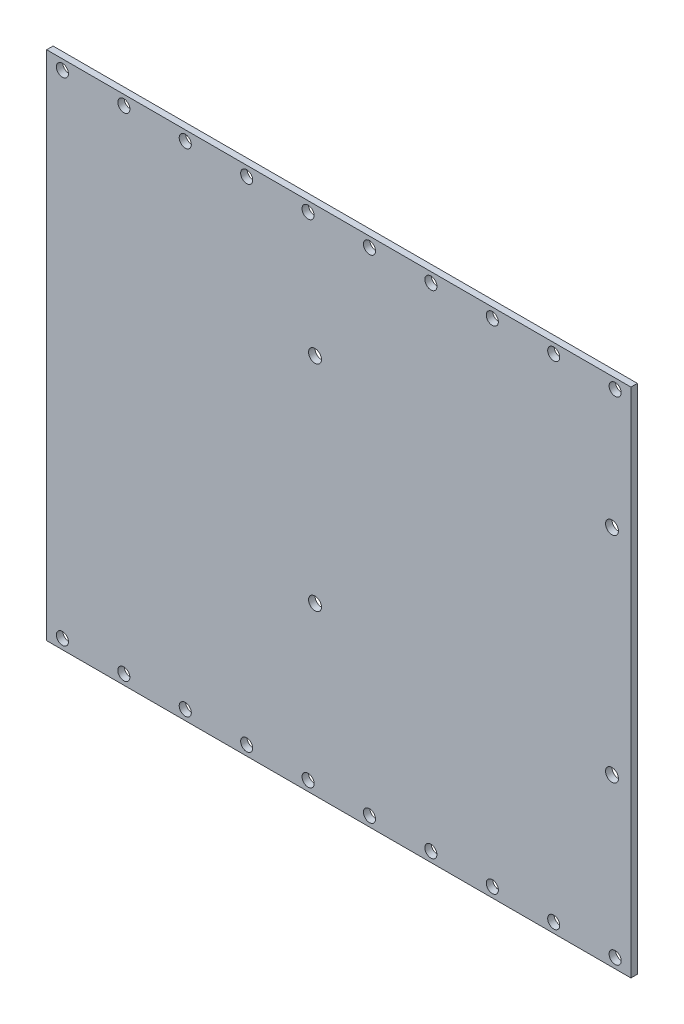
ISO-10303-21;
HEADER;
FILE_DESCRIPTION(('STEP AP214'),'2;1');
FILE_NAME('part.step','',(''),(''),'','','');
FILE_SCHEMA(('AUTOMOTIVE_DESIGN { 1 0 10303 214 1 1 1 1 }'));
ENDSEC;
DATA;
#1=APPLICATION_CONTEXT('core data for automotive mechanical design processes');
#2=APPLICATION_PROTOCOL_DEFINITION('international standard','automotive_design',2000,#1);
#3=PRODUCT_CONTEXT('',#1,'mechanical');
#4=PRODUCT('Part','Part','',(#3));
#5=PRODUCT_RELATED_PRODUCT_CATEGORY('part','',(#4));
#6=PRODUCT_DEFINITION_FORMATION('','',#4);
#7=PRODUCT_DEFINITION_CONTEXT('part definition',#1,'design');
#8=PRODUCT_DEFINITION('design','',#6,#7);
#9=PRODUCT_DEFINITION_SHAPE('','',#8);
#10=(LENGTH_UNIT() NAMED_UNIT(*) SI_UNIT(.MILLI.,.METRE.));
#11=(NAMED_UNIT(*) PLANE_ANGLE_UNIT() SI_UNIT($,.RADIAN.));
#12=(NAMED_UNIT(*) SI_UNIT($,.STERADIAN.) SOLID_ANGLE_UNIT());
#13=UNCERTAINTY_MEASURE_WITH_UNIT(LENGTH_MEASURE(1.E-05),#10,'distance_accuracy_value','');
#14=(GEOMETRIC_REPRESENTATION_CONTEXT(3) GLOBAL_UNCERTAINTY_ASSIGNED_CONTEXT((#13)) GLOBAL_UNIT_ASSIGNED_CONTEXT((#10,
#11,#12)) REPRESENTATION_CONTEXT('',''));
#15=CARTESIAN_POINT('',(0.,0.,0.));
#16=DIRECTION('',(0.,0.,1.));
#17=DIRECTION('',(1.,0.,0.));
#18=AXIS2_PLACEMENT_3D('',#15,#16,#17);
#19=CARTESIAN_POINT('',(72.5,63.5,1.6));
#20=DIRECTION('',(-1.,0.,0.));
#21=DIRECTION('',(0.,-1.,0.));
#22=AXIS2_PLACEMENT_3D('',#19,#20,#21);
#23=PLANE('',#22);
#24=DIRECTION('',(0.,1.,0.));
#25=VECTOR('',#24,1.);
#26=CARTESIAN_POINT('',(72.5,63.5,0.));
#27=LINE('',#26,#25);
#28=CARTESIAN_POINT('',(72.5,-63.5,0.));
#29=VERTEX_POINT('',#28);
#30=CARTESIAN_POINT('',(72.5,63.5,0.));
#31=VERTEX_POINT('',#30);
#32=EDGE_CURVE('E101',#29,#31,#27,.T.);
#33=ORIENTED_EDGE('',*,*,#32,.T.);
#34=DIRECTION('',(0.,0.,-1.));
#35=VECTOR('',#34,1.);
#36=CARTESIAN_POINT('',(72.5,63.5,1.6));
#37=LINE('',#36,#35);
#38=CARTESIAN_POINT('',(72.5,63.5,1.6));
#39=VERTEX_POINT('',#38);
#40=EDGE_CURVE('E11',#39,#31,#37,.T.);
#41=ORIENTED_EDGE('',*,*,#40,.F.);
#42=DIRECTION('',(0.,1.,0.));
#43=VECTOR('',#42,1.);
#44=CARTESIAN_POINT('',(72.5,63.5,1.6));
#45=LINE('',#44,#43);
#46=CARTESIAN_POINT('',(72.5,-63.5,1.6));
#47=VERTEX_POINT('',#46);
#48=EDGE_CURVE('E89',#47,#39,#45,.T.);
#49=ORIENTED_EDGE('',*,*,#48,.F.);
#50=DIRECTION('',(0.,0.,-1.));
#51=VECTOR('',#50,1.);
#52=CARTESIAN_POINT('',(72.5,-63.5,1.6));
#53=LINE('',#52,#51);
#54=EDGE_CURVE('E97',#47,#29,#53,.T.);
#55=ORIENTED_EDGE('',*,*,#54,.T.);
#56=EDGE_LOOP('',(#33,#41,#49,#55));
#57=FACE_BOUND('',#56,.T.);
#58=ADVANCED_FACE('F38',(#57),#23,.F.);
#59=CARTESIAN_POINT('',(-72.5,63.5,1.6));
#60=DIRECTION('',(0.,-1.,0.));
#61=DIRECTION('',(1.,0.,0.));
#62=AXIS2_PLACEMENT_3D('',#59,#60,#61);
#63=PLANE('',#62);
#64=DIRECTION('',(-1.,0.,0.));
#65=VECTOR('',#64,1.);
#66=CARTESIAN_POINT('',(-72.5,63.5,0.));
#67=LINE('',#66,#65);
#68=CARTESIAN_POINT('',(-72.5,63.5,0.));
#69=VERTEX_POINT('',#68);
#70=EDGE_CURVE('E93',#31,#69,#67,.T.);
#71=ORIENTED_EDGE('',*,*,#70,.T.);
#72=DIRECTION('',(0.,0.,-1.));
#73=VECTOR('',#72,1.);
#74=CARTESIAN_POINT('',(-72.5,63.5,1.6));
#75=LINE('',#74,#73);
#76=CARTESIAN_POINT('',(-72.5,63.5,1.6));
#77=VERTEX_POINT('',#76);
#78=EDGE_CURVE('E46',#77,#69,#75,.T.);
#79=ORIENTED_EDGE('',*,*,#78,.F.);
#80=DIRECTION('',(-1.,0.,0.));
#81=VECTOR('',#80,1.);
#82=CARTESIAN_POINT('',(-72.5,63.5,1.6));
#83=LINE('',#82,#81);
#84=EDGE_CURVE('E84',#39,#77,#83,.T.);
#85=ORIENTED_EDGE('',*,*,#84,.F.);
#86=ORIENTED_EDGE('',*,*,#40,.T.);
#87=EDGE_LOOP('',(#71,#79,#85,#86));
#88=FACE_BOUND('',#87,.T.);
#89=ADVANCED_FACE('F92',(#88),#63,.F.);
#90=CARTESIAN_POINT('',(-72.5,63.5,1.6));
#91=DIRECTION('',(1.,0.,0.));
#92=DIRECTION('',(0.,1.,0.));
#93=AXIS2_PLACEMENT_3D('',#90,#91,#92);
#94=PLANE('',#93);
#95=DIRECTION('',(0.,-1.,0.));
#96=VECTOR('',#95,1.);
#97=CARTESIAN_POINT('',(-72.5,63.5,0.));
#98=LINE('',#97,#96);
#99=CARTESIAN_POINT('',(-72.5,-63.5,0.));
#100=VERTEX_POINT('',#99);
#101=EDGE_CURVE('E71',#69,#100,#98,.T.);
#102=ORIENTED_EDGE('',*,*,#101,.T.);
#103=DIRECTION('',(0.,0.,-1.));
#104=VECTOR('',#103,1.);
#105=CARTESIAN_POINT('',(-72.5,-63.5,1.6));
#106=LINE('',#105,#104);
#107=CARTESIAN_POINT('',(-72.5,-63.5,1.6));
#108=VERTEX_POINT('',#107);
#109=EDGE_CURVE('E94',#108,#100,#106,.T.);
#110=ORIENTED_EDGE('',*,*,#109,.F.);
#111=DIRECTION('',(0.,-1.,0.));
#112=VECTOR('',#111,1.);
#113=CARTESIAN_POINT('',(-72.5,63.5,1.6));
#114=LINE('',#113,#112);
#115=EDGE_CURVE('E87',#77,#108,#114,.T.);
#116=ORIENTED_EDGE('',*,*,#115,.F.);
#117=ORIENTED_EDGE('',*,*,#78,.T.);
#118=EDGE_LOOP('',(#102,#110,#116,#117));
#119=FACE_BOUND('',#118,.T.);
#120=ADVANCED_FACE('F95',(#119),#94,.F.);
#121=CARTESIAN_POINT('',(-72.5,-63.5,1.6));
#122=DIRECTION('',(0.,1.,0.));
#123=DIRECTION('',(0.,0.,1.));
#124=AXIS2_PLACEMENT_3D('',#121,#122,#123);
#125=PLANE('',#124);
#126=DIRECTION('',(1.,0.,0.));
#127=VECTOR('',#126,1.);
#128=CARTESIAN_POINT('',(-72.5,-63.5,0.));
#129=LINE('',#128,#127);
#130=EDGE_CURVE('E77',#100,#29,#129,.T.);
#131=ORIENTED_EDGE('',*,*,#130,.T.);
#132=ORIENTED_EDGE('',*,*,#54,.F.);
#133=DIRECTION('',(1.,0.,0.));
#134=VECTOR('',#133,1.);
#135=CARTESIAN_POINT('',(-72.5,-63.5,1.6));
#136=LINE('',#135,#134);
#137=EDGE_CURVE('E54',#108,#47,#136,.T.);
#138=ORIENTED_EDGE('',*,*,#137,.F.);
#139=ORIENTED_EDGE('',*,*,#109,.T.);
#140=EDGE_LOOP('',(#131,#132,#138,#139));
#141=FACE_BOUND('',#140,.T.);
#142=ADVANCED_FACE('F109',(#141),#125,.F.);
#143=CARTESIAN_POINT('',(0.,0.,1.6));
#144=DIRECTION('',(0.,0.,1.));
#145=DIRECTION('',(1.,0.,0.));
#146=AXIS2_PLACEMENT_3D('',#143,#144,#145);
#147=PLANE('',#146);
#148=CARTESIAN_POINT('',(67.8,31.,1.6));
#149=DIRECTION('',(0.,0.,1.));
#150=DIRECTION('',(1.,0.,0.));
#151=AXIS2_PLACEMENT_3D('',#148,#149,#150);
#152=CIRCLE('',#151,1.60000000000001);
#153=CARTESIAN_POINT('',(69.4,31.,1.6));
#154=VERTEX_POINT('',#153);
#155=EDGE_CURVE('E255',#154,#154,#152,.T.);
#156=ORIENTED_EDGE('',*,*,#155,.F.);
#157=EDGE_LOOP('',(#156));
#158=FACE_BOUND('',#157,.T.);
#159=CARTESIAN_POINT('',(-5.90000000000002,31.,1.6));
#160=DIRECTION('',(0.,0.,1.));
#161=DIRECTION('',(1.,0.,0.));
#162=AXIS2_PLACEMENT_3D('',#159,#160,#161);
#163=CIRCLE('',#162,1.59999999999999);
#164=CARTESIAN_POINT('',(-4.30000000000003,31.,1.6));
#165=VERTEX_POINT('',#164);
#166=EDGE_CURVE('E249',#165,#165,#163,.T.);
#167=ORIENTED_EDGE('',*,*,#166,.F.);
#168=EDGE_LOOP('',(#167));
#169=FACE_BOUND('',#168,.T.);
#170=CARTESIAN_POINT('',(-5.90000000000002,-22.2,1.6));
#171=DIRECTION('',(0.,0.,1.));
#172=DIRECTION('',(1.,0.,0.));
#173=AXIS2_PLACEMENT_3D('',#170,#171,#172);
#174=CIRCLE('',#173,1.60000000000002);
#175=CARTESIAN_POINT('',(-4.3,-22.2,1.6));
#176=VERTEX_POINT('',#175);
#177=EDGE_CURVE('E243',#176,#176,#174,.T.);
#178=ORIENTED_EDGE('',*,*,#177,.F.);
#179=EDGE_LOOP('',(#178));
#180=FACE_BOUND('',#179,.T.);
#181=CARTESIAN_POINT('',(67.8,-22.2,1.6));
#182=DIRECTION('',(0.,0.,1.));
#183=DIRECTION('',(1.,0.,0.));
#184=AXIS2_PLACEMENT_3D('',#181,#182,#183);
#185=CIRCLE('',#184,1.6);
#186=CARTESIAN_POINT('',(69.4,-22.2,1.6));
#187=VERTEX_POINT('',#186);
#188=EDGE_CURVE('E237',#187,#187,#185,.T.);
#189=ORIENTED_EDGE('',*,*,#188,.F.);
#190=EDGE_LOOP('',(#189));
#191=FACE_BOUND('',#190,.T.);
#192=CARTESIAN_POINT('',(68.5799999999953,61.0499964397141,1.6));
#193=DIRECTION('',(0.,0.,-1.));
#194=DIRECTION('',(-1.,0.,0.));
#195=AXIS2_PLACEMENT_3D('',#192,#193,#194);
#196=CIRCLE('',#195,1.49999999999999);
#197=CARTESIAN_POINT('',(67.0799999999953,61.0499964397141,1.6));
#198=VERTEX_POINT('',#197);
#199=EDGE_CURVE('E228',#198,#198,#196,.T.);
#200=ORIENTED_EDGE('',*,*,#199,.T.);
#201=EDGE_LOOP('',(#200));
#202=FACE_BOUND('',#201,.T.);
#203=CARTESIAN_POINT('',(38.0999999999953,61.0499964397141,1.6));
#204=DIRECTION('',(0.,0.,-1.));
#205=DIRECTION('',(-1.,0.,0.));
#206=AXIS2_PLACEMENT_3D('',#203,#204,#205);
#207=CIRCLE('',#206,1.49999999999999);
#208=CARTESIAN_POINT('',(36.5999999999953,61.0499964397141,1.6));
#209=VERTEX_POINT('',#208);
#210=EDGE_CURVE('E222',#209,#209,#207,.T.);
#211=ORIENTED_EDGE('',*,*,#210,.T.);
#212=EDGE_LOOP('',(#211));
#213=FACE_BOUND('',#212,.T.);
#214=CARTESIAN_POINT('',(7.61999999999532,61.0499964397141,1.6));
#215=DIRECTION('',(0.,0.,-1.));
#216=DIRECTION('',(-1.,0.,0.));
#217=AXIS2_PLACEMENT_3D('',#214,#215,#216);
#218=CIRCLE('',#217,1.49999999999999);
#219=CARTESIAN_POINT('',(6.11999999999534,61.0499964397141,1.6));
#220=VERTEX_POINT('',#219);
#221=EDGE_CURVE('E216',#220,#220,#218,.T.);
#222=ORIENTED_EDGE('',*,*,#221,.T.);
#223=EDGE_LOOP('',(#222));
#224=FACE_BOUND('',#223,.T.);
#225=CARTESIAN_POINT('',(-22.8600000000047,61.0499964397141,1.6));
#226=DIRECTION('',(0.,0.,-1.));
#227=DIRECTION('',(-1.,0.,0.));
#228=AXIS2_PLACEMENT_3D('',#225,#226,#227);
#229=CIRCLE('',#228,1.49999999999999);
#230=CARTESIAN_POINT('',(-24.3600000000047,61.0499964397141,1.6));
#231=VERTEX_POINT('',#230);
#232=EDGE_CURVE('E210',#231,#231,#229,.T.);
#233=ORIENTED_EDGE('',*,*,#232,.T.);
#234=EDGE_LOOP('',(#233));
#235=FACE_BOUND('',#234,.T.);
#236=CARTESIAN_POINT('',(-53.3400000000047,61.0499964397141,1.6));
#237=DIRECTION('',(0.,0.,-1.));
#238=DIRECTION('',(-1.,0.,0.));
#239=AXIS2_PLACEMENT_3D('',#236,#237,#238);
#240=CIRCLE('',#239,1.49999999999999);
#241=CARTESIAN_POINT('',(-54.8400000000047,61.0499964397141,1.6));
#242=VERTEX_POINT('',#241);
#243=EDGE_CURVE('E204',#242,#242,#240,.T.);
#244=ORIENTED_EDGE('',*,*,#243,.T.);
#245=EDGE_LOOP('',(#244));
#246=FACE_BOUND('',#245,.T.);
#247=CARTESIAN_POINT('',(-68.5800000000047,61.0499964397141,1.6));
#248=DIRECTION('',(0.,0.,-1.));
#249=DIRECTION('',(-1.,0.,0.));
#250=AXIS2_PLACEMENT_3D('',#247,#248,#249);
#251=CIRCLE('',#250,1.49999999999999);
#252=CARTESIAN_POINT('',(-70.0800000000047,61.0499964397141,1.6));
#253=VERTEX_POINT('',#252);
#254=EDGE_CURVE('E198',#253,#253,#251,.T.);
#255=ORIENTED_EDGE('',*,*,#254,.T.);
#256=EDGE_LOOP('',(#255));
#257=FACE_BOUND('',#256,.T.);
#258=CARTESIAN_POINT('',(68.5799999999953,-61.0500035602859,1.6));
#259=DIRECTION('',(0.,0.,-1.));
#260=DIRECTION('',(-1.,0.,0.));
#261=AXIS2_PLACEMENT_3D('',#258,#259,#260);
#262=CIRCLE('',#261,1.49999999999999);
#263=CARTESIAN_POINT('',(67.0799999999953,-61.0500035602859,1.6));
#264=VERTEX_POINT('',#263);
#265=EDGE_CURVE('E192',#264,#264,#262,.T.);
#266=ORIENTED_EDGE('',*,*,#265,.T.);
#267=EDGE_LOOP('',(#266));
#268=FACE_BOUND('',#267,.T.);
#269=CARTESIAN_POINT('',(53.3399999999953,-61.0500035602859,1.6));
#270=DIRECTION('',(0.,0.,-1.));
#271=DIRECTION('',(-1.,0.,0.));
#272=AXIS2_PLACEMENT_3D('',#269,#270,#271);
#273=CIRCLE('',#272,1.49999999999999);
#274=CARTESIAN_POINT('',(51.8399999999953,-61.0500035602859,1.6));
#275=VERTEX_POINT('',#274);
#276=EDGE_CURVE('E186',#275,#275,#273,.T.);
#277=ORIENTED_EDGE('',*,*,#276,.T.);
#278=EDGE_LOOP('',(#277));
#279=FACE_BOUND('',#278,.T.);
#280=CARTESIAN_POINT('',(38.0999999999953,-61.0500035602859,1.6));
#281=DIRECTION('',(0.,0.,-1.));
#282=DIRECTION('',(-1.,0.,0.));
#283=AXIS2_PLACEMENT_3D('',#280,#281,#282);
#284=CIRCLE('',#283,1.49999999999999);
#285=CARTESIAN_POINT('',(36.5999999999953,-61.0500035602859,1.6));
#286=VERTEX_POINT('',#285);
#287=EDGE_CURVE('E180',#286,#286,#284,.T.);
#288=ORIENTED_EDGE('',*,*,#287,.T.);
#289=EDGE_LOOP('',(#288));
#290=FACE_BOUND('',#289,.T.);
#291=CARTESIAN_POINT('',(22.8599999999953,-61.0500035602859,1.6));
#292=DIRECTION('',(0.,0.,-1.));
#293=DIRECTION('',(-1.,0.,0.));
#294=AXIS2_PLACEMENT_3D('',#291,#292,#293);
#295=CIRCLE('',#294,1.49999999999999);
#296=CARTESIAN_POINT('',(21.3599999999953,-61.0500035602859,1.6));
#297=VERTEX_POINT('',#296);
#298=EDGE_CURVE('E174',#297,#297,#295,.T.);
#299=ORIENTED_EDGE('',*,*,#298,.T.);
#300=EDGE_LOOP('',(#299));
#301=FACE_BOUND('',#300,.T.);
#302=CARTESIAN_POINT('',(7.61999999999532,-61.0500035602859,1.6));
#303=DIRECTION('',(0.,0.,-1.));
#304=DIRECTION('',(-1.,0.,0.));
#305=AXIS2_PLACEMENT_3D('',#302,#303,#304);
#306=CIRCLE('',#305,1.49999999999999);
#307=CARTESIAN_POINT('',(6.11999999999534,-61.0500035602859,1.6));
#308=VERTEX_POINT('',#307);
#309=EDGE_CURVE('E168',#308,#308,#306,.T.);
#310=ORIENTED_EDGE('',*,*,#309,.T.);
#311=EDGE_LOOP('',(#310));
#312=FACE_BOUND('',#311,.T.);
#313=CARTESIAN_POINT('',(-7.62000000000468,-61.0500035602859,1.6));
#314=DIRECTION('',(0.,0.,-1.));
#315=DIRECTION('',(-1.,0.,0.));
#316=AXIS2_PLACEMENT_3D('',#313,#314,#315);
#317=CIRCLE('',#316,1.49999999999999);
#318=CARTESIAN_POINT('',(-9.12000000000467,-61.0500035602859,1.6));
#319=VERTEX_POINT('',#318);
#320=EDGE_CURVE('E162',#319,#319,#317,.T.);
#321=ORIENTED_EDGE('',*,*,#320,.T.);
#322=EDGE_LOOP('',(#321));
#323=FACE_BOUND('',#322,.T.);
#324=CARTESIAN_POINT('',(-22.8600000000047,-61.0500035602859,1.6));
#325=DIRECTION('',(0.,0.,-1.));
#326=DIRECTION('',(-1.,0.,0.));
#327=AXIS2_PLACEMENT_3D('',#324,#325,#326);
#328=CIRCLE('',#327,1.49999999999999);
#329=CARTESIAN_POINT('',(-24.3600000000047,-61.0500035602859,1.6));
#330=VERTEX_POINT('',#329);
#331=EDGE_CURVE('E156',#330,#330,#328,.T.);
#332=ORIENTED_EDGE('',*,*,#331,.T.);
#333=EDGE_LOOP('',(#332));
#334=FACE_BOUND('',#333,.T.);
#335=CARTESIAN_POINT('',(-38.1000000000047,-61.0500035602859,1.6));
#336=DIRECTION('',(0.,0.,-1.));
#337=DIRECTION('',(-1.,0.,0.));
#338=AXIS2_PLACEMENT_3D('',#335,#336,#337);
#339=CIRCLE('',#338,1.49999999999999);
#340=CARTESIAN_POINT('',(-39.6000000000047,-61.0500035602859,1.6));
#341=VERTEX_POINT('',#340);
#342=EDGE_CURVE('E150',#341,#341,#339,.T.);
#343=ORIENTED_EDGE('',*,*,#342,.T.);
#344=EDGE_LOOP('',(#343));
#345=FACE_BOUND('',#344,.T.);
#346=CARTESIAN_POINT('',(-53.3400000000047,-61.0500035602859,1.6));
#347=DIRECTION('',(0.,0.,-1.));
#348=DIRECTION('',(-1.,0.,0.));
#349=AXIS2_PLACEMENT_3D('',#346,#347,#348);
#350=CIRCLE('',#349,1.49999999999999);
#351=CARTESIAN_POINT('',(-54.8400000000047,-61.0500035602859,1.6));
#352=VERTEX_POINT('',#351);
#353=EDGE_CURVE('E144',#352,#352,#350,.T.);
#354=ORIENTED_EDGE('',*,*,#353,.T.);
#355=EDGE_LOOP('',(#354));
#356=FACE_BOUND('',#355,.T.);
#357=CARTESIAN_POINT('',(-68.5800000000047,-61.0500035602859,1.6));
#358=DIRECTION('',(0.,0.,-1.));
#359=DIRECTION('',(-1.,0.,0.));
#360=AXIS2_PLACEMENT_3D('',#357,#358,#359);
#361=CIRCLE('',#360,1.49999999999999);
#362=CARTESIAN_POINT('',(-70.0800000000047,-61.0500035602859,1.6));
#363=VERTEX_POINT('',#362);
#364=EDGE_CURVE('E138',#363,#363,#361,.T.);
#365=ORIENTED_EDGE('',*,*,#364,.T.);
#366=EDGE_LOOP('',(#365));
#367=FACE_BOUND('',#366,.T.);
#368=CARTESIAN_POINT('',(-38.1000000000047,61.0499964397141,1.6));
#369=DIRECTION('',(0.,0.,-1.));
#370=DIRECTION('',(-1.,0.,0.));
#371=AXIS2_PLACEMENT_3D('',#368,#369,#370);
#372=CIRCLE('',#371,1.49999999999999);
#373=CARTESIAN_POINT('',(-39.6000000000047,61.0499964397141,1.6));
#374=VERTEX_POINT('',#373);
#375=EDGE_CURVE('E132',#374,#374,#372,.T.);
#376=ORIENTED_EDGE('',*,*,#375,.T.);
#377=EDGE_LOOP('',(#376));
#378=FACE_BOUND('',#377,.T.);
#379=CARTESIAN_POINT('',(-7.62000000000468,61.0499964397141,1.6));
#380=DIRECTION('',(0.,0.,-1.));
#381=DIRECTION('',(-1.,0.,0.));
#382=AXIS2_PLACEMENT_3D('',#379,#380,#381);
#383=CIRCLE('',#382,1.49999999999999);
#384=CARTESIAN_POINT('',(-9.12000000000467,61.0499964397141,1.6));
#385=VERTEX_POINT('',#384);
#386=EDGE_CURVE('E126',#385,#385,#383,.T.);
#387=ORIENTED_EDGE('',*,*,#386,.T.);
#388=EDGE_LOOP('',(#387));
#389=FACE_BOUND('',#388,.T.);
#390=CARTESIAN_POINT('',(22.8599999999953,61.0499964397141,1.6));
#391=DIRECTION('',(0.,0.,-1.));
#392=DIRECTION('',(-1.,0.,0.));
#393=AXIS2_PLACEMENT_3D('',#390,#391,#392);
#394=CIRCLE('',#393,1.49999999999999);
#395=CARTESIAN_POINT('',(21.3599999999953,61.0499964397141,1.6));
#396=VERTEX_POINT('',#395);
#397=EDGE_CURVE('E120',#396,#396,#394,.T.);
#398=ORIENTED_EDGE('',*,*,#397,.T.);
#399=EDGE_LOOP('',(#398));
#400=FACE_BOUND('',#399,.T.);
#401=CARTESIAN_POINT('',(53.3399999999953,61.0499964397141,1.6));
#402=DIRECTION('',(0.,0.,-1.));
#403=DIRECTION('',(-1.,0.,0.));
#404=AXIS2_PLACEMENT_3D('',#401,#402,#403);
#405=CIRCLE('',#404,1.49999999999999);
#406=CARTESIAN_POINT('',(51.8399999999953,61.0499964397141,1.6));
#407=VERTEX_POINT('',#406);
#408=EDGE_CURVE('E104',#407,#407,#405,.T.);
#409=ORIENTED_EDGE('',*,*,#408,.T.);
#410=EDGE_LOOP('',(#409));
#411=FACE_BOUND('',#410,.T.);
#412=ORIENTED_EDGE('',*,*,#48,.T.);
#413=ORIENTED_EDGE('',*,*,#84,.T.);
#414=ORIENTED_EDGE('',*,*,#115,.T.);
#415=ORIENTED_EDGE('',*,*,#137,.T.);
#416=EDGE_LOOP('',(#412,#413,#414,#415));
#417=FACE_BOUND('',#416,.T.);
#418=ADVANCED_FACE('F85',(#158,#169,#180,#191,#202,#213,#224,#235,#246,#257,#268,#279,#290,#301,
#312,#323,#334,#345,#356,#367,#378,#389,#400,#411,#417),#147,.T.);
#419=CARTESIAN_POINT('',(0.,0.,0.));
#420=DIRECTION('',(0.,0.,1.));
#421=DIRECTION('',(1.,0.,0.));
#422=AXIS2_PLACEMENT_3D('',#419,#420,#421);
#423=PLANE('',#422);
#424=CARTESIAN_POINT('',(67.8,31.,0.));
#425=DIRECTION('',(0.,0.,1.));
#426=DIRECTION('',(1.,0.,0.));
#427=AXIS2_PLACEMENT_3D('',#424,#425,#426);
#428=CIRCLE('',#427,1.60000000000001);
#429=CARTESIAN_POINT('',(69.4,31.,0.));
#430=VERTEX_POINT('',#429);
#431=EDGE_CURVE('E252',#430,#430,#428,.F.);
#432=ORIENTED_EDGE('',*,*,#431,.F.);
#433=EDGE_LOOP('',(#432));
#434=FACE_BOUND('',#433,.T.);
#435=CARTESIAN_POINT('',(-5.90000000000002,31.,0.));
#436=DIRECTION('',(0.,0.,1.));
#437=DIRECTION('',(1.,0.,0.));
#438=AXIS2_PLACEMENT_3D('',#435,#436,#437);
#439=CIRCLE('',#438,1.59999999999999);
#440=CARTESIAN_POINT('',(-4.30000000000003,31.,0.));
#441=VERTEX_POINT('',#440);
#442=EDGE_CURVE('E246',#441,#441,#439,.F.);
#443=ORIENTED_EDGE('',*,*,#442,.F.);
#444=EDGE_LOOP('',(#443));
#445=FACE_BOUND('',#444,.T.);
#446=CARTESIAN_POINT('',(-5.90000000000002,-22.2,0.));
#447=DIRECTION('',(0.,0.,1.));
#448=DIRECTION('',(1.,0.,0.));
#449=AXIS2_PLACEMENT_3D('',#446,#447,#448);
#450=CIRCLE('',#449,1.60000000000002);
#451=CARTESIAN_POINT('',(-4.3,-22.2,0.));
#452=VERTEX_POINT('',#451);
#453=EDGE_CURVE('E240',#452,#452,#450,.F.);
#454=ORIENTED_EDGE('',*,*,#453,.F.);
#455=EDGE_LOOP('',(#454));
#456=FACE_BOUND('',#455,.T.);
#457=CARTESIAN_POINT('',(67.8,-22.2,0.));
#458=DIRECTION('',(0.,0.,1.));
#459=DIRECTION('',(1.,0.,0.));
#460=AXIS2_PLACEMENT_3D('',#457,#458,#459);
#461=CIRCLE('',#460,1.6);
#462=CARTESIAN_POINT('',(69.4,-22.2,0.));
#463=VERTEX_POINT('',#462);
#464=EDGE_CURVE('E234',#463,#463,#461,.F.);
#465=ORIENTED_EDGE('',*,*,#464,.F.);
#466=EDGE_LOOP('',(#465));
#467=FACE_BOUND('',#466,.T.);
#468=CARTESIAN_POINT('',(68.5799999999953,61.0499964397141,0.));
#469=DIRECTION('',(0.,0.,-1.));
#470=DIRECTION('',(-1.,0.,0.));
#471=AXIS2_PLACEMENT_3D('',#468,#469,#470);
#472=CIRCLE('',#471,1.49999999999999);
#473=CARTESIAN_POINT('',(67.0799999999953,61.0499964397141,0.));
#474=VERTEX_POINT('',#473);
#475=EDGE_CURVE('E231',#474,#474,#472,.T.);
#476=ORIENTED_EDGE('',*,*,#475,.F.);
#477=EDGE_LOOP('',(#476));
#478=FACE_BOUND('',#477,.T.);
#479=CARTESIAN_POINT('',(38.0999999999953,61.0499964397141,0.));
#480=DIRECTION('',(0.,0.,-1.));
#481=DIRECTION('',(-1.,0.,0.));
#482=AXIS2_PLACEMENT_3D('',#479,#480,#481);
#483=CIRCLE('',#482,1.49999999999999);
#484=CARTESIAN_POINT('',(36.5999999999953,61.0499964397141,0.));
#485=VERTEX_POINT('',#484);
#486=EDGE_CURVE('E225',#485,#485,#483,.T.);
#487=ORIENTED_EDGE('',*,*,#486,.F.);
#488=EDGE_LOOP('',(#487));
#489=FACE_BOUND('',#488,.T.);
#490=CARTESIAN_POINT('',(7.61999999999532,61.0499964397141,0.));
#491=DIRECTION('',(0.,0.,-1.));
#492=DIRECTION('',(-1.,0.,0.));
#493=AXIS2_PLACEMENT_3D('',#490,#491,#492);
#494=CIRCLE('',#493,1.49999999999999);
#495=CARTESIAN_POINT('',(6.11999999999534,61.0499964397141,0.));
#496=VERTEX_POINT('',#495);
#497=EDGE_CURVE('E219',#496,#496,#494,.T.);
#498=ORIENTED_EDGE('',*,*,#497,.F.);
#499=EDGE_LOOP('',(#498));
#500=FACE_BOUND('',#499,.T.);
#501=CARTESIAN_POINT('',(-22.8600000000047,61.0499964397141,0.));
#502=DIRECTION('',(0.,0.,-1.));
#503=DIRECTION('',(-1.,0.,0.));
#504=AXIS2_PLACEMENT_3D('',#501,#502,#503);
#505=CIRCLE('',#504,1.49999999999999);
#506=CARTESIAN_POINT('',(-24.3600000000047,61.0499964397141,0.));
#507=VERTEX_POINT('',#506);
#508=EDGE_CURVE('E213',#507,#507,#505,.T.);
#509=ORIENTED_EDGE('',*,*,#508,.F.);
#510=EDGE_LOOP('',(#509));
#511=FACE_BOUND('',#510,.T.);
#512=CARTESIAN_POINT('',(-53.3400000000047,61.0499964397141,0.));
#513=DIRECTION('',(0.,0.,-1.));
#514=DIRECTION('',(-1.,0.,0.));
#515=AXIS2_PLACEMENT_3D('',#512,#513,#514);
#516=CIRCLE('',#515,1.49999999999999);
#517=CARTESIAN_POINT('',(-54.8400000000047,61.0499964397141,0.));
#518=VERTEX_POINT('',#517);
#519=EDGE_CURVE('E207',#518,#518,#516,.T.);
#520=ORIENTED_EDGE('',*,*,#519,.F.);
#521=EDGE_LOOP('',(#520));
#522=FACE_BOUND('',#521,.T.);
#523=CARTESIAN_POINT('',(-68.5800000000047,61.0499964397141,0.));
#524=DIRECTION('',(0.,0.,-1.));
#525=DIRECTION('',(-1.,0.,0.));
#526=AXIS2_PLACEMENT_3D('',#523,#524,#525);
#527=CIRCLE('',#526,1.49999999999999);
#528=CARTESIAN_POINT('',(-70.0800000000047,61.0499964397141,0.));
#529=VERTEX_POINT('',#528);
#530=EDGE_CURVE('E201',#529,#529,#527,.T.);
#531=ORIENTED_EDGE('',*,*,#530,.F.);
#532=EDGE_LOOP('',(#531));
#533=FACE_BOUND('',#532,.T.);
#534=CARTESIAN_POINT('',(68.5799999999953,-61.0500035602859,0.));
#535=DIRECTION('',(0.,0.,-1.));
#536=DIRECTION('',(-1.,0.,0.));
#537=AXIS2_PLACEMENT_3D('',#534,#535,#536);
#538=CIRCLE('',#537,1.49999999999999);
#539=CARTESIAN_POINT('',(67.0799999999953,-61.0500035602859,0.));
#540=VERTEX_POINT('',#539);
#541=EDGE_CURVE('E195',#540,#540,#538,.T.);
#542=ORIENTED_EDGE('',*,*,#541,.F.);
#543=EDGE_LOOP('',(#542));
#544=FACE_BOUND('',#543,.T.);
#545=CARTESIAN_POINT('',(53.3399999999953,-61.0500035602859,0.));
#546=DIRECTION('',(0.,0.,-1.));
#547=DIRECTION('',(-1.,0.,0.));
#548=AXIS2_PLACEMENT_3D('',#545,#546,#547);
#549=CIRCLE('',#548,1.49999999999999);
#550=CARTESIAN_POINT('',(51.8399999999953,-61.0500035602859,0.));
#551=VERTEX_POINT('',#550);
#552=EDGE_CURVE('E189',#551,#551,#549,.T.);
#553=ORIENTED_EDGE('',*,*,#552,.F.);
#554=EDGE_LOOP('',(#553));
#555=FACE_BOUND('',#554,.T.);
#556=CARTESIAN_POINT('',(38.0999999999953,-61.0500035602859,0.));
#557=DIRECTION('',(0.,0.,-1.));
#558=DIRECTION('',(-1.,0.,0.));
#559=AXIS2_PLACEMENT_3D('',#556,#557,#558);
#560=CIRCLE('',#559,1.49999999999999);
#561=CARTESIAN_POINT('',(36.5999999999953,-61.0500035602859,0.));
#562=VERTEX_POINT('',#561);
#563=EDGE_CURVE('E183',#562,#562,#560,.T.);
#564=ORIENTED_EDGE('',*,*,#563,.F.);
#565=EDGE_LOOP('',(#564));
#566=FACE_BOUND('',#565,.T.);
#567=CARTESIAN_POINT('',(22.8599999999953,-61.0500035602859,0.));
#568=DIRECTION('',(0.,0.,-1.));
#569=DIRECTION('',(-1.,0.,0.));
#570=AXIS2_PLACEMENT_3D('',#567,#568,#569);
#571=CIRCLE('',#570,1.49999999999999);
#572=CARTESIAN_POINT('',(21.3599999999953,-61.0500035602859,0.));
#573=VERTEX_POINT('',#572);
#574=EDGE_CURVE('E177',#573,#573,#571,.T.);
#575=ORIENTED_EDGE('',*,*,#574,.F.);
#576=EDGE_LOOP('',(#575));
#577=FACE_BOUND('',#576,.T.);
#578=CARTESIAN_POINT('',(7.61999999999532,-61.0500035602859,0.));
#579=DIRECTION('',(0.,0.,-1.));
#580=DIRECTION('',(-1.,0.,0.));
#581=AXIS2_PLACEMENT_3D('',#578,#579,#580);
#582=CIRCLE('',#581,1.49999999999999);
#583=CARTESIAN_POINT('',(6.11999999999534,-61.0500035602859,0.));
#584=VERTEX_POINT('',#583);
#585=EDGE_CURVE('E171',#584,#584,#582,.T.);
#586=ORIENTED_EDGE('',*,*,#585,.F.);
#587=EDGE_LOOP('',(#586));
#588=FACE_BOUND('',#587,.T.);
#589=CARTESIAN_POINT('',(-7.62000000000468,-61.0500035602859,0.));
#590=DIRECTION('',(0.,0.,-1.));
#591=DIRECTION('',(-1.,0.,0.));
#592=AXIS2_PLACEMENT_3D('',#589,#590,#591);
#593=CIRCLE('',#592,1.49999999999999);
#594=CARTESIAN_POINT('',(-9.12000000000467,-61.0500035602859,0.));
#595=VERTEX_POINT('',#594);
#596=EDGE_CURVE('E165',#595,#595,#593,.T.);
#597=ORIENTED_EDGE('',*,*,#596,.F.);
#598=EDGE_LOOP('',(#597));
#599=FACE_BOUND('',#598,.T.);
#600=CARTESIAN_POINT('',(-22.8600000000047,-61.0500035602859,0.));
#601=DIRECTION('',(0.,0.,-1.));
#602=DIRECTION('',(-1.,0.,0.));
#603=AXIS2_PLACEMENT_3D('',#600,#601,#602);
#604=CIRCLE('',#603,1.49999999999999);
#605=CARTESIAN_POINT('',(-24.3600000000047,-61.0500035602859,0.));
#606=VERTEX_POINT('',#605);
#607=EDGE_CURVE('E159',#606,#606,#604,.T.);
#608=ORIENTED_EDGE('',*,*,#607,.F.);
#609=EDGE_LOOP('',(#608));
#610=FACE_BOUND('',#609,.T.);
#611=CARTESIAN_POINT('',(-38.1000000000047,-61.0500035602859,0.));
#612=DIRECTION('',(0.,0.,-1.));
#613=DIRECTION('',(-1.,0.,0.));
#614=AXIS2_PLACEMENT_3D('',#611,#612,#613);
#615=CIRCLE('',#614,1.49999999999999);
#616=CARTESIAN_POINT('',(-39.6000000000047,-61.0500035602859,0.));
#617=VERTEX_POINT('',#616);
#618=EDGE_CURVE('E153',#617,#617,#615,.T.);
#619=ORIENTED_EDGE('',*,*,#618,.F.);
#620=EDGE_LOOP('',(#619));
#621=FACE_BOUND('',#620,.T.);
#622=CARTESIAN_POINT('',(-53.3400000000047,-61.0500035602859,0.));
#623=DIRECTION('',(0.,0.,-1.));
#624=DIRECTION('',(-1.,0.,0.));
#625=AXIS2_PLACEMENT_3D('',#622,#623,#624);
#626=CIRCLE('',#625,1.49999999999999);
#627=CARTESIAN_POINT('',(-54.8400000000047,-61.0500035602859,0.));
#628=VERTEX_POINT('',#627);
#629=EDGE_CURVE('E147',#628,#628,#626,.T.);
#630=ORIENTED_EDGE('',*,*,#629,.F.);
#631=EDGE_LOOP('',(#630));
#632=FACE_BOUND('',#631,.T.);
#633=CARTESIAN_POINT('',(-68.5800000000047,-61.0500035602859,0.));
#634=DIRECTION('',(0.,0.,-1.));
#635=DIRECTION('',(-1.,0.,0.));
#636=AXIS2_PLACEMENT_3D('',#633,#634,#635);
#637=CIRCLE('',#636,1.49999999999999);
#638=CARTESIAN_POINT('',(-70.0800000000047,-61.0500035602859,0.));
#639=VERTEX_POINT('',#638);
#640=EDGE_CURVE('E141',#639,#639,#637,.T.);
#641=ORIENTED_EDGE('',*,*,#640,.F.);
#642=EDGE_LOOP('',(#641));
#643=FACE_BOUND('',#642,.T.);
#644=CARTESIAN_POINT('',(-38.1000000000047,61.0499964397141,0.));
#645=DIRECTION('',(0.,0.,-1.));
#646=DIRECTION('',(-1.,0.,0.));
#647=AXIS2_PLACEMENT_3D('',#644,#645,#646);
#648=CIRCLE('',#647,1.49999999999999);
#649=CARTESIAN_POINT('',(-39.6000000000047,61.0499964397141,0.));
#650=VERTEX_POINT('',#649);
#651=EDGE_CURVE('E135',#650,#650,#648,.T.);
#652=ORIENTED_EDGE('',*,*,#651,.F.);
#653=EDGE_LOOP('',(#652));
#654=FACE_BOUND('',#653,.T.);
#655=CARTESIAN_POINT('',(-7.62000000000468,61.0499964397141,0.));
#656=DIRECTION('',(0.,0.,-1.));
#657=DIRECTION('',(-1.,0.,0.));
#658=AXIS2_PLACEMENT_3D('',#655,#656,#657);
#659=CIRCLE('',#658,1.49999999999999);
#660=CARTESIAN_POINT('',(-9.12000000000467,61.0499964397141,0.));
#661=VERTEX_POINT('',#660);
#662=EDGE_CURVE('E129',#661,#661,#659,.T.);
#663=ORIENTED_EDGE('',*,*,#662,.F.);
#664=EDGE_LOOP('',(#663));
#665=FACE_BOUND('',#664,.T.);
#666=CARTESIAN_POINT('',(22.8599999999953,61.0499964397141,0.));
#667=DIRECTION('',(0.,0.,-1.));
#668=DIRECTION('',(-1.,0.,0.));
#669=AXIS2_PLACEMENT_3D('',#666,#667,#668);
#670=CIRCLE('',#669,1.49999999999999);
#671=CARTESIAN_POINT('',(21.3599999999953,61.0499964397141,0.));
#672=VERTEX_POINT('',#671);
#673=EDGE_CURVE('E123',#672,#672,#670,.T.);
#674=ORIENTED_EDGE('',*,*,#673,.F.);
#675=EDGE_LOOP('',(#674));
#676=FACE_BOUND('',#675,.T.);
#677=CARTESIAN_POINT('',(53.3399999999953,61.0499964397141,0.));
#678=DIRECTION('',(0.,0.,-1.));
#679=DIRECTION('',(-1.,0.,0.));
#680=AXIS2_PLACEMENT_3D('',#677,#678,#679);
#681=CIRCLE('',#680,1.49999999999999);
#682=CARTESIAN_POINT('',(51.8399999999953,61.0499964397141,0.));
#683=VERTEX_POINT('',#682);
#684=EDGE_CURVE('E117',#683,#683,#681,.T.);
#685=ORIENTED_EDGE('',*,*,#684,.F.);
#686=EDGE_LOOP('',(#685));
#687=FACE_BOUND('',#686,.T.);
#688=ORIENTED_EDGE('',*,*,#32,.F.);
#689=ORIENTED_EDGE('',*,*,#130,.F.);
#690=ORIENTED_EDGE('',*,*,#101,.F.);
#691=ORIENTED_EDGE('',*,*,#70,.F.);
#692=EDGE_LOOP('',(#688,#689,#690,#691));
#693=FACE_BOUND('',#692,.T.);
#694=ADVANCED_FACE('F112',(#434,#445,#456,#467,#478,#489,#500,#511,#522,#533,#544,#555,#566,
#577,#588,#599,#610,#621,#632,#643,#654,#665,#676,#687,#693),#423,.F.);
#695=CARTESIAN_POINT('',(53.3399999999953,61.0499964397141,0.));
#696=DIRECTION('',(0.,0.,-1.));
#697=DIRECTION('',(-1.,0.,0.));
#698=AXIS2_PLACEMENT_3D('',#695,#696,#697);
#699=CYLINDRICAL_SURFACE('',#698,1.49999999999999);
#700=ORIENTED_EDGE('',*,*,#408,.F.);
#701=EDGE_LOOP('',(#700));
#702=FACE_BOUND('',#701,.T.);
#703=ORIENTED_EDGE('',*,*,#684,.T.);
#704=EDGE_LOOP('',(#703));
#705=FACE_BOUND('',#704,.T.);
#706=ADVANCED_FACE('F311',(#702,#705),#699,.F.);
#707=CARTESIAN_POINT('',(22.8599999999953,61.0499964397141,0.));
#708=DIRECTION('',(0.,0.,-1.));
#709=DIRECTION('',(-1.,0.,0.));
#710=AXIS2_PLACEMENT_3D('',#707,#708,#709);
#711=CYLINDRICAL_SURFACE('',#710,1.49999999999999);
#712=ORIENTED_EDGE('',*,*,#397,.F.);
#713=EDGE_LOOP('',(#712));
#714=FACE_BOUND('',#713,.T.);
#715=ORIENTED_EDGE('',*,*,#673,.T.);
#716=EDGE_LOOP('',(#715));
#717=FACE_BOUND('',#716,.T.);
#718=ADVANCED_FACE('F314',(#714,#717),#711,.F.);
#719=CARTESIAN_POINT('',(-7.62000000000468,61.0499964397141,0.));
#720=DIRECTION('',(0.,0.,-1.));
#721=DIRECTION('',(-1.,0.,0.));
#722=AXIS2_PLACEMENT_3D('',#719,#720,#721);
#723=CYLINDRICAL_SURFACE('',#722,1.49999999999999);
#724=ORIENTED_EDGE('',*,*,#386,.F.);
#725=EDGE_LOOP('',(#724));
#726=FACE_BOUND('',#725,.T.);
#727=ORIENTED_EDGE('',*,*,#662,.T.);
#728=EDGE_LOOP('',(#727));
#729=FACE_BOUND('',#728,.T.);
#730=ADVANCED_FACE('F361',(#726,#729),#723,.F.);
#731=CARTESIAN_POINT('',(-38.1000000000047,61.0499964397141,0.));
#732=DIRECTION('',(0.,0.,-1.));
#733=DIRECTION('',(-1.,0.,0.));
#734=AXIS2_PLACEMENT_3D('',#731,#732,#733);
#735=CYLINDRICAL_SURFACE('',#734,1.49999999999999);
#736=ORIENTED_EDGE('',*,*,#375,.F.);
#737=EDGE_LOOP('',(#736));
#738=FACE_BOUND('',#737,.T.);
#739=ORIENTED_EDGE('',*,*,#651,.T.);
#740=EDGE_LOOP('',(#739));
#741=FACE_BOUND('',#740,.T.);
#742=ADVANCED_FACE('F369',(#738,#741),#735,.F.);
#743=CARTESIAN_POINT('',(-68.5800000000047,-61.0500035602859,0.));
#744=DIRECTION('',(0.,0.,-1.));
#745=DIRECTION('',(-1.,0.,0.));
#746=AXIS2_PLACEMENT_3D('',#743,#744,#745);
#747=CYLINDRICAL_SURFACE('',#746,1.49999999999999);
#748=ORIENTED_EDGE('',*,*,#364,.F.);
#749=EDGE_LOOP('',(#748));
#750=FACE_BOUND('',#749,.T.);
#751=ORIENTED_EDGE('',*,*,#640,.T.);
#752=EDGE_LOOP('',(#751));
#753=FACE_BOUND('',#752,.T.);
#754=ADVANCED_FACE('F377',(#750,#753),#747,.F.);
#755=CARTESIAN_POINT('',(-53.3400000000047,-61.0500035602859,0.));
#756=DIRECTION('',(0.,0.,-1.));
#757=DIRECTION('',(-1.,0.,0.));
#758=AXIS2_PLACEMENT_3D('',#755,#756,#757);
#759=CYLINDRICAL_SURFACE('',#758,1.49999999999999);
#760=ORIENTED_EDGE('',*,*,#353,.F.);
#761=EDGE_LOOP('',(#760));
#762=FACE_BOUND('',#761,.T.);
#763=ORIENTED_EDGE('',*,*,#629,.T.);
#764=EDGE_LOOP('',(#763));
#765=FACE_BOUND('',#764,.T.);
#766=ADVANCED_FACE('F385',(#762,#765),#759,.F.);
#767=CARTESIAN_POINT('',(-38.1000000000047,-61.0500035602859,0.));
#768=DIRECTION('',(0.,0.,-1.));
#769=DIRECTION('',(-1.,0.,0.));
#770=AXIS2_PLACEMENT_3D('',#767,#768,#769);
#771=CYLINDRICAL_SURFACE('',#770,1.49999999999999);
#772=ORIENTED_EDGE('',*,*,#342,.F.);
#773=EDGE_LOOP('',(#772));
#774=FACE_BOUND('',#773,.T.);
#775=ORIENTED_EDGE('',*,*,#618,.T.);
#776=EDGE_LOOP('',(#775));
#777=FACE_BOUND('',#776,.T.);
#778=ADVANCED_FACE('F393',(#774,#777),#771,.F.);
#779=CARTESIAN_POINT('',(-22.8600000000047,-61.0500035602859,0.));
#780=DIRECTION('',(0.,0.,-1.));
#781=DIRECTION('',(-1.,0.,0.));
#782=AXIS2_PLACEMENT_3D('',#779,#780,#781);
#783=CYLINDRICAL_SURFACE('',#782,1.49999999999999);
#784=ORIENTED_EDGE('',*,*,#331,.F.);
#785=EDGE_LOOP('',(#784));
#786=FACE_BOUND('',#785,.T.);
#787=ORIENTED_EDGE('',*,*,#607,.T.);
#788=EDGE_LOOP('',(#787));
#789=FACE_BOUND('',#788,.T.);
#790=ADVANCED_FACE('F401',(#786,#789),#783,.F.);
#791=CARTESIAN_POINT('',(-7.62000000000468,-61.0500035602859,0.));
#792=DIRECTION('',(0.,0.,-1.));
#793=DIRECTION('',(-1.,0.,0.));
#794=AXIS2_PLACEMENT_3D('',#791,#792,#793);
#795=CYLINDRICAL_SURFACE('',#794,1.49999999999999);
#796=ORIENTED_EDGE('',*,*,#320,.F.);
#797=EDGE_LOOP('',(#796));
#798=FACE_BOUND('',#797,.T.);
#799=ORIENTED_EDGE('',*,*,#596,.T.);
#800=EDGE_LOOP('',(#799));
#801=FACE_BOUND('',#800,.T.);
#802=ADVANCED_FACE('F409',(#798,#801),#795,.F.);
#803=CARTESIAN_POINT('',(7.61999999999532,-61.0500035602859,0.));
#804=DIRECTION('',(0.,0.,-1.));
#805=DIRECTION('',(-1.,0.,0.));
#806=AXIS2_PLACEMENT_3D('',#803,#804,#805);
#807=CYLINDRICAL_SURFACE('',#806,1.49999999999999);
#808=ORIENTED_EDGE('',*,*,#309,.F.);
#809=EDGE_LOOP('',(#808));
#810=FACE_BOUND('',#809,.T.);
#811=ORIENTED_EDGE('',*,*,#585,.T.);
#812=EDGE_LOOP('',(#811));
#813=FACE_BOUND('',#812,.T.);
#814=ADVANCED_FACE('F417',(#810,#813),#807,.F.);
#815=CARTESIAN_POINT('',(22.8599999999953,-61.0500035602859,0.));
#816=DIRECTION('',(0.,0.,-1.));
#817=DIRECTION('',(-1.,0.,0.));
#818=AXIS2_PLACEMENT_3D('',#815,#816,#817);
#819=CYLINDRICAL_SURFACE('',#818,1.49999999999999);
#820=ORIENTED_EDGE('',*,*,#298,.F.);
#821=EDGE_LOOP('',(#820));
#822=FACE_BOUND('',#821,.T.);
#823=ORIENTED_EDGE('',*,*,#574,.T.);
#824=EDGE_LOOP('',(#823));
#825=FACE_BOUND('',#824,.T.);
#826=ADVANCED_FACE('F425',(#822,#825),#819,.F.);
#827=CARTESIAN_POINT('',(38.0999999999953,-61.0500035602859,0.));
#828=DIRECTION('',(0.,0.,-1.));
#829=DIRECTION('',(-1.,0.,0.));
#830=AXIS2_PLACEMENT_3D('',#827,#828,#829);
#831=CYLINDRICAL_SURFACE('',#830,1.49999999999999);
#832=ORIENTED_EDGE('',*,*,#287,.F.);
#833=EDGE_LOOP('',(#832));
#834=FACE_BOUND('',#833,.T.);
#835=ORIENTED_EDGE('',*,*,#563,.T.);
#836=EDGE_LOOP('',(#835));
#837=FACE_BOUND('',#836,.T.);
#838=ADVANCED_FACE('F433',(#834,#837),#831,.F.);
#839=CARTESIAN_POINT('',(53.3399999999953,-61.0500035602859,0.));
#840=DIRECTION('',(0.,0.,-1.));
#841=DIRECTION('',(-1.,0.,0.));
#842=AXIS2_PLACEMENT_3D('',#839,#840,#841);
#843=CYLINDRICAL_SURFACE('',#842,1.49999999999999);
#844=ORIENTED_EDGE('',*,*,#276,.F.);
#845=EDGE_LOOP('',(#844));
#846=FACE_BOUND('',#845,.T.);
#847=ORIENTED_EDGE('',*,*,#552,.T.);
#848=EDGE_LOOP('',(#847));
#849=FACE_BOUND('',#848,.T.);
#850=ADVANCED_FACE('F441',(#846,#849),#843,.F.);
#851=CARTESIAN_POINT('',(68.5799999999953,-61.0500035602859,0.));
#852=DIRECTION('',(0.,0.,-1.));
#853=DIRECTION('',(-1.,0.,0.));
#854=AXIS2_PLACEMENT_3D('',#851,#852,#853);
#855=CYLINDRICAL_SURFACE('',#854,1.49999999999999);
#856=ORIENTED_EDGE('',*,*,#265,.F.);
#857=EDGE_LOOP('',(#856));
#858=FACE_BOUND('',#857,.T.);
#859=ORIENTED_EDGE('',*,*,#541,.T.);
#860=EDGE_LOOP('',(#859));
#861=FACE_BOUND('',#860,.T.);
#862=ADVANCED_FACE('F449',(#858,#861),#855,.F.);
#863=CARTESIAN_POINT('',(-68.5800000000047,61.0499964397141,0.));
#864=DIRECTION('',(0.,0.,-1.));
#865=DIRECTION('',(-1.,0.,0.));
#866=AXIS2_PLACEMENT_3D('',#863,#864,#865);
#867=CYLINDRICAL_SURFACE('',#866,1.49999999999999);
#868=ORIENTED_EDGE('',*,*,#254,.F.);
#869=EDGE_LOOP('',(#868));
#870=FACE_BOUND('',#869,.T.);
#871=ORIENTED_EDGE('',*,*,#530,.T.);
#872=EDGE_LOOP('',(#871));
#873=FACE_BOUND('',#872,.T.);
#874=ADVANCED_FACE('F457',(#870,#873),#867,.F.);
#875=CARTESIAN_POINT('',(-53.3400000000047,61.0499964397141,0.));
#876=DIRECTION('',(0.,0.,-1.));
#877=DIRECTION('',(-1.,0.,0.));
#878=AXIS2_PLACEMENT_3D('',#875,#876,#877);
#879=CYLINDRICAL_SURFACE('',#878,1.49999999999999);
#880=ORIENTED_EDGE('',*,*,#243,.F.);
#881=EDGE_LOOP('',(#880));
#882=FACE_BOUND('',#881,.T.);
#883=ORIENTED_EDGE('',*,*,#519,.T.);
#884=EDGE_LOOP('',(#883));
#885=FACE_BOUND('',#884,.T.);
#886=ADVANCED_FACE('F465',(#882,#885),#879,.F.);
#887=CARTESIAN_POINT('',(-22.8600000000047,61.0499964397141,0.));
#888=DIRECTION('',(0.,0.,-1.));
#889=DIRECTION('',(-1.,0.,0.));
#890=AXIS2_PLACEMENT_3D('',#887,#888,#889);
#891=CYLINDRICAL_SURFACE('',#890,1.49999999999999);
#892=ORIENTED_EDGE('',*,*,#232,.F.);
#893=EDGE_LOOP('',(#892));
#894=FACE_BOUND('',#893,.T.);
#895=ORIENTED_EDGE('',*,*,#508,.T.);
#896=EDGE_LOOP('',(#895));
#897=FACE_BOUND('',#896,.T.);
#898=ADVANCED_FACE('F473',(#894,#897),#891,.F.);
#899=CARTESIAN_POINT('',(7.61999999999532,61.0499964397141,0.));
#900=DIRECTION('',(0.,0.,-1.));
#901=DIRECTION('',(-1.,0.,0.));
#902=AXIS2_PLACEMENT_3D('',#899,#900,#901);
#903=CYLINDRICAL_SURFACE('',#902,1.49999999999999);
#904=ORIENTED_EDGE('',*,*,#221,.F.);
#905=EDGE_LOOP('',(#904));
#906=FACE_BOUND('',#905,.T.);
#907=ORIENTED_EDGE('',*,*,#497,.T.);
#908=EDGE_LOOP('',(#907));
#909=FACE_BOUND('',#908,.T.);
#910=ADVANCED_FACE('F481',(#906,#909),#903,.F.);
#911=CARTESIAN_POINT('',(38.0999999999953,61.0499964397141,0.));
#912=DIRECTION('',(0.,0.,-1.));
#913=DIRECTION('',(-1.,0.,0.));
#914=AXIS2_PLACEMENT_3D('',#911,#912,#913);
#915=CYLINDRICAL_SURFACE('',#914,1.49999999999999);
#916=ORIENTED_EDGE('',*,*,#210,.F.);
#917=EDGE_LOOP('',(#916));
#918=FACE_BOUND('',#917,.T.);
#919=ORIENTED_EDGE('',*,*,#486,.T.);
#920=EDGE_LOOP('',(#919));
#921=FACE_BOUND('',#920,.T.);
#922=ADVANCED_FACE('F489',(#918,#921),#915,.F.);
#923=CARTESIAN_POINT('',(68.5799999999953,61.0499964397141,0.));
#924=DIRECTION('',(0.,0.,-1.));
#925=DIRECTION('',(-1.,0.,0.));
#926=AXIS2_PLACEMENT_3D('',#923,#924,#925);
#927=CYLINDRICAL_SURFACE('',#926,1.49999999999999);
#928=ORIENTED_EDGE('',*,*,#199,.F.);
#929=EDGE_LOOP('',(#928));
#930=FACE_BOUND('',#929,.T.);
#931=ORIENTED_EDGE('',*,*,#475,.T.);
#932=EDGE_LOOP('',(#931));
#933=FACE_BOUND('',#932,.T.);
#934=ADVANCED_FACE('F497',(#930,#933),#927,.F.);
#935=CARTESIAN_POINT('',(67.8,-22.2,-0.00100000000000143));
#936=DIRECTION('',(0.,0.,1.));
#937=DIRECTION('',(1.,0.,0.));
#938=AXIS2_PLACEMENT_3D('',#935,#936,#937);
#939=CYLINDRICAL_SURFACE('',#938,1.6);
#940=ORIENTED_EDGE('',*,*,#188,.T.);
#941=EDGE_LOOP('',(#940));
#942=FACE_BOUND('',#941,.T.);
#943=ORIENTED_EDGE('',*,*,#464,.T.);
#944=EDGE_LOOP('',(#943));
#945=FACE_BOUND('',#944,.T.);
#946=ADVANCED_FACE('F504',(#942,#945),#939,.F.);
#947=CARTESIAN_POINT('',(-5.90000000000002,-22.2,-0.00100000000000143));
#948=DIRECTION('',(0.,0.,1.));
#949=DIRECTION('',(1.,0.,0.));
#950=AXIS2_PLACEMENT_3D('',#947,#948,#949);
#951=CYLINDRICAL_SURFACE('',#950,1.60000000000002);
#952=ORIENTED_EDGE('',*,*,#177,.T.);
#953=EDGE_LOOP('',(#952));
#954=FACE_BOUND('',#953,.T.);
#955=ORIENTED_EDGE('',*,*,#453,.T.);
#956=EDGE_LOOP('',(#955));
#957=FACE_BOUND('',#956,.T.);
#958=ADVANCED_FACE('F511',(#954,#957),#951,.F.);
#959=CARTESIAN_POINT('',(-5.90000000000002,31.,-0.00100000000000143));
#960=DIRECTION('',(0.,0.,1.));
#961=DIRECTION('',(1.,0.,0.));
#962=AXIS2_PLACEMENT_3D('',#959,#960,#961);
#963=CYLINDRICAL_SURFACE('',#962,1.59999999999999);
#964=ORIENTED_EDGE('',*,*,#166,.T.);
#965=EDGE_LOOP('',(#964));
#966=FACE_BOUND('',#965,.T.);
#967=ORIENTED_EDGE('',*,*,#442,.T.);
#968=EDGE_LOOP('',(#967));
#969=FACE_BOUND('',#968,.T.);
#970=ADVANCED_FACE('F519',(#966,#969),#963,.F.);
#971=CARTESIAN_POINT('',(67.8,31.,-0.00100000000000143));
#972=DIRECTION('',(0.,0.,1.));
#973=DIRECTION('',(1.,0.,0.));
#974=AXIS2_PLACEMENT_3D('',#971,#972,#973);
#975=CYLINDRICAL_SURFACE('',#974,1.60000000000001);
#976=ORIENTED_EDGE('',*,*,#155,.T.);
#977=EDGE_LOOP('',(#976));
#978=FACE_BOUND('',#977,.T.);
#979=ORIENTED_EDGE('',*,*,#431,.T.);
#980=EDGE_LOOP('',(#979));
#981=FACE_BOUND('',#980,.T.);
#982=ADVANCED_FACE('F259',(#978,#981),#975,.F.);
#983=CLOSED_SHELL('',(#58,#89,#120,#142,#418,#694,#706,#718,#730,#742,#754,#766,#778,#790,#802,
#814,#826,#838,#850,#862,#874,#886,#898,#910,#922,#934,#946,#958,#970,#982));
#984=MANIFOLD_SOLID_BREP('B2',#983);
#985=ADVANCED_BREP_SHAPE_REPRESENTATION('',(#18,#984),#14);
#986=SHAPE_DEFINITION_REPRESENTATION(#9,#985);
ENDSEC;
END-ISO-10303-21;
